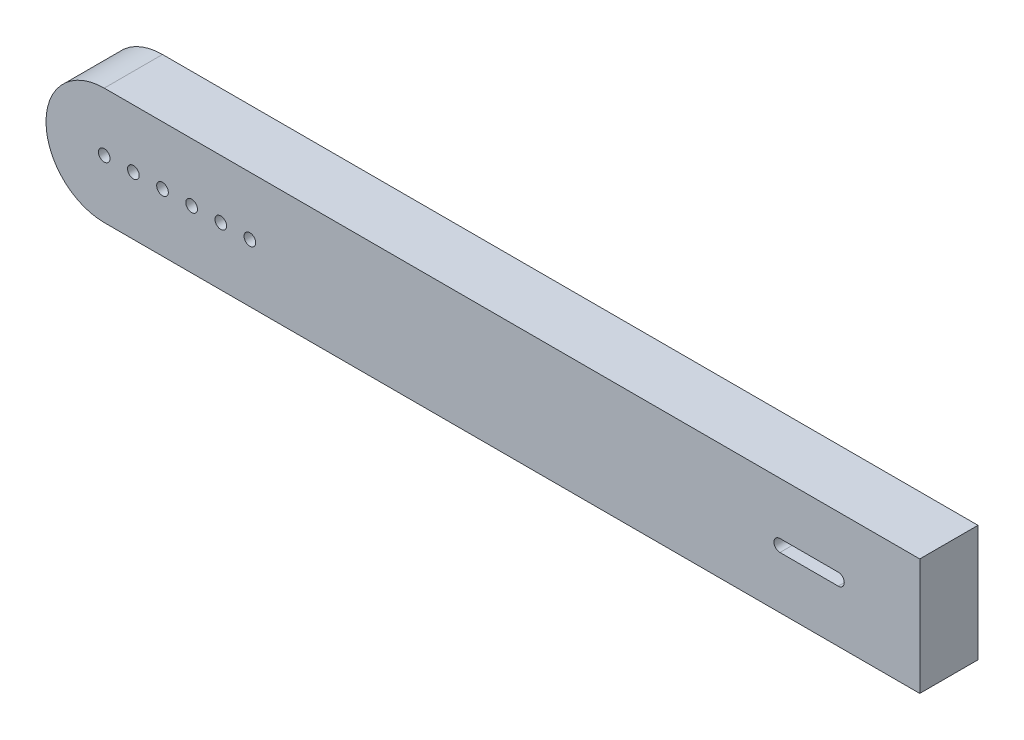
ISO-10303-21;
HEADER;
FILE_DESCRIPTION(('STEP AP214'),'2;1');
FILE_NAME('part.step','',(''),(''),'','','');
FILE_SCHEMA(('AUTOMOTIVE_DESIGN { 1 0 10303 214 1 1 1 1 }'));
ENDSEC;
DATA;
#1=APPLICATION_CONTEXT('core data for automotive mechanical design processes');
#2=APPLICATION_PROTOCOL_DEFINITION('international standard','automotive_design',2000,#1);
#3=PRODUCT_CONTEXT('',#1,'mechanical');
#4=PRODUCT('Part','Part','',(#3));
#5=PRODUCT_RELATED_PRODUCT_CATEGORY('part','',(#4));
#6=PRODUCT_DEFINITION_FORMATION('','',#4);
#7=PRODUCT_DEFINITION_CONTEXT('part definition',#1,'design');
#8=PRODUCT_DEFINITION('design','',#6,#7);
#9=PRODUCT_DEFINITION_SHAPE('','',#8);
#10=(LENGTH_UNIT() NAMED_UNIT(*) SI_UNIT(.MILLI.,.METRE.));
#11=(NAMED_UNIT(*) PLANE_ANGLE_UNIT() SI_UNIT($,.RADIAN.));
#12=(NAMED_UNIT(*) SI_UNIT($,.STERADIAN.) SOLID_ANGLE_UNIT());
#13=UNCERTAINTY_MEASURE_WITH_UNIT(LENGTH_MEASURE(1.E-05),#10,'distance_accuracy_value','');
#14=(GEOMETRIC_REPRESENTATION_CONTEXT(3) GLOBAL_UNCERTAINTY_ASSIGNED_CONTEXT((#13)) GLOBAL_UNIT_ASSIGNED_CONTEXT((#10,
#11,#12)) REPRESENTATION_CONTEXT('',''));
#15=CARTESIAN_POINT('',(0.,0.,0.));
#16=DIRECTION('',(0.,0.,1.));
#17=DIRECTION('',(1.,0.,0.));
#18=AXIS2_PLACEMENT_3D('',#15,#16,#17);
#19=CARTESIAN_POINT('',(-37.7797527357395,-0.499321037751495,6.35));
#20=DIRECTION('',(0.,0.,-1.));
#21=DIRECTION('',(-1.,0.,0.));
#22=AXIS2_PLACEMENT_3D('',#19,#20,#21);
#23=CYLINDRICAL_SURFACE('',#22,0.635000000000003);
#24=CARTESIAN_POINT('',(-37.7797527357395,-0.499321037751495,0.));
#25=DIRECTION('',(0.,0.,1.));
#26=DIRECTION('',(1.,0.,0.));
#27=AXIS2_PLACEMENT_3D('',#24,#25,#26);
#28=CIRCLE('',#27,0.635000000000003);
#29=CARTESIAN_POINT('',(-37.1447527492601,-0.499189998819663,0.));
#30=VERTEX_POINT('',#29);
#31=CARTESIAN_POINT('',(-37.1447527357395,-0.499321037751482,0.));
#32=VERTEX_POINT('',#31);
#33=EDGE_CURVE('E200',#30,#32,#28,.T.);
#34=ORIENTED_EDGE('',*,*,#33,.F.);
#35=DIRECTION('',(0.,0.,-1.));
#36=VECTOR('',#35,1.);
#37=CARTESIAN_POINT('',(-37.1447527492601,-0.499189998819663,6.35));
#38=LINE('',#37,#36);
#39=CARTESIAN_POINT('',(-37.1447527492601,-0.499189998819663,6.35));
#40=VERTEX_POINT('',#39);
#41=EDGE_CURVE('E216',#40,#30,#38,.T.);
#42=ORIENTED_EDGE('',*,*,#41,.F.);
#43=CARTESIAN_POINT('',(-37.7797527357395,-0.499321037751495,6.35));
#44=DIRECTION('',(0.,0.,1.));
#45=DIRECTION('',(1.,0.,0.));
#46=AXIS2_PLACEMENT_3D('',#43,#44,#45);
#47=CIRCLE('',#46,0.635000000000003);
#48=CARTESIAN_POINT('',(-37.1447527357395,-0.499321037751482,6.35));
#49=VERTEX_POINT('',#48);
#50=EDGE_CURVE('E167',#40,#49,#47,.T.);
#51=ORIENTED_EDGE('',*,*,#50,.T.);
#52=DIRECTION('',(0.,0.,-1.));
#53=VECTOR('',#52,1.);
#54=CARTESIAN_POINT('',(-37.1447527357395,-0.499321037751482,6.35));
#55=LINE('',#54,#53);
#56=EDGE_CURVE('E214',#49,#32,#55,.T.);
#57=ORIENTED_EDGE('',*,*,#56,.T.);
#58=EDGE_LOOP('',(#34,#42,#51,#57));
#59=FACE_BOUND('',#58,.T.);
#60=ADVANCED_FACE('F43',(#59),#23,.F.);
#61=CARTESIAN_POINT('',(0.,5.8506789622485,6.35));
#62=DIRECTION('',(0.,1.,0.));
#63=DIRECTION('',(0.,0.,1.));
#64=AXIS2_PLACEMENT_3D('',#61,#62,#63);
#65=PLANE('',#64);
#66=DIRECTION('',(1.,0.,0.));
#67=VECTOR('',#66,1.);
#68=CARTESIAN_POINT('',(0.,5.8506789622485,0.));
#69=LINE('',#68,#67);
#70=CARTESIAN_POINT('',(-40.9547527357395,5.8506789622485,0.));
#71=VERTEX_POINT('',#70);
#72=CARTESIAN_POINT('',(47.9452472642605,5.8506789622485,0.));
#73=VERTEX_POINT('',#72);
#74=EDGE_CURVE('E185',#71,#73,#69,.T.);
#75=ORIENTED_EDGE('',*,*,#74,.F.);
#76=DIRECTION('',(0.,0.,-1.));
#77=VECTOR('',#76,1.);
#78=CARTESIAN_POINT('',(-40.9547527357395,5.8506789622485,6.35));
#79=LINE('',#78,#77);
#80=CARTESIAN_POINT('',(-40.9547527357395,5.8506789622485,6.35));
#81=VERTEX_POINT('',#80);
#82=EDGE_CURVE('E217',#81,#71,#79,.T.);
#83=ORIENTED_EDGE('',*,*,#82,.F.);
#84=DIRECTION('',(1.,0.,0.));
#85=VECTOR('',#84,1.);
#86=CARTESIAN_POINT('',(0.,5.8506789622485,6.35));
#87=LINE('',#86,#85);
#88=CARTESIAN_POINT('',(47.9452472642605,5.8506789622485,6.35));
#89=VERTEX_POINT('',#88);
#90=EDGE_CURVE('E152',#81,#89,#87,.T.);
#91=ORIENTED_EDGE('',*,*,#90,.T.);
#92=DIRECTION('',(0.,0.,-1.));
#93=VECTOR('',#92,1.);
#94=CARTESIAN_POINT('',(47.9452472642605,5.8506789622485,6.35));
#95=LINE('',#94,#93);
#96=EDGE_CURVE('E182',#89,#73,#95,.T.);
#97=ORIENTED_EDGE('',*,*,#96,.T.);
#98=EDGE_LOOP('',(#75,#83,#91,#97));
#99=FACE_BOUND('',#98,.T.);
#100=ADVANCED_FACE('F248',(#99),#65,.T.);
#101=CARTESIAN_POINT('',(-40.9547527357395,-0.499321037751496,6.35));
#102=DIRECTION('',(0.,0.,-1.));
#103=DIRECTION('',(-1.,0.,0.));
#104=AXIS2_PLACEMENT_3D('',#101,#102,#103);
#105=CYLINDRICAL_SURFACE('',#104,6.35);
#106=CARTESIAN_POINT('',(-40.9547527357395,-0.499321037751496,0.));
#107=DIRECTION('',(0.,0.,1.));
#108=DIRECTION('',(1.,0.,0.));
#109=AXIS2_PLACEMENT_3D('',#106,#107,#108);
#110=CIRCLE('',#109,6.35);
#111=CARTESIAN_POINT('',(-40.9547527357395,-6.8493210377515,0.));
#112=VERTEX_POINT('',#111);
#113=EDGE_CURVE('E188',#71,#112,#110,.T.);
#114=ORIENTED_EDGE('',*,*,#113,.T.);
#115=DIRECTION('',(0.,0.,-1.));
#116=VECTOR('',#115,1.);
#117=CARTESIAN_POINT('',(-40.9547527357395,-6.8493210377515,6.35));
#118=LINE('',#117,#116);
#119=CARTESIAN_POINT('',(-40.9547527357395,-6.8493210377515,6.35));
#120=VERTEX_POINT('',#119);
#121=EDGE_CURVE('E224',#120,#112,#118,.T.);
#122=ORIENTED_EDGE('',*,*,#121,.F.);
#123=CARTESIAN_POINT('',(-40.9547527357395,-0.499321037751496,6.35));
#124=DIRECTION('',(0.,0.,1.));
#125=DIRECTION('',(1.,0.,0.));
#126=AXIS2_PLACEMENT_3D('',#123,#124,#125);
#127=CIRCLE('',#126,6.35);
#128=EDGE_CURVE('E156',#81,#120,#127,.T.);
#129=ORIENTED_EDGE('',*,*,#128,.F.);
#130=ORIENTED_EDGE('',*,*,#82,.T.);
#131=EDGE_LOOP('',(#114,#122,#129,#130));
#132=FACE_BOUND('',#131,.T.);
#133=ADVANCED_FACE('F254',(#132),#105,.T.);
#134=CARTESIAN_POINT('',(0.,-6.8493210377515,6.35));
#135=DIRECTION('',(0.,1.,0.));
#136=DIRECTION('',(0.,0.,1.));
#137=AXIS2_PLACEMENT_3D('',#134,#135,#136);
#138=PLANE('',#137);
#139=DIRECTION('',(1.,0.,0.));
#140=VECTOR('',#139,1.);
#141=CARTESIAN_POINT('',(0.,-6.8493210377515,0.));
#142=LINE('',#141,#140);
#143=CARTESIAN_POINT('',(47.9452472642605,-6.8493210377515,0.));
#144=VERTEX_POINT('',#143);
#145=EDGE_CURVE('E191',#112,#144,#142,.T.);
#146=ORIENTED_EDGE('',*,*,#145,.T.);
#147=DIRECTION('',(0.,0.,-1.));
#148=VECTOR('',#147,1.);
#149=CARTESIAN_POINT('',(47.9452472642605,-6.8493210377515,6.35));
#150=LINE('',#149,#148);
#151=CARTESIAN_POINT('',(47.9452472642605,-6.8493210377515,6.35));
#152=VERTEX_POINT('',#151);
#153=EDGE_CURVE('E221',#152,#144,#150,.T.);
#154=ORIENTED_EDGE('',*,*,#153,.F.);
#155=DIRECTION('',(1.,0.,0.));
#156=VECTOR('',#155,1.);
#157=CARTESIAN_POINT('',(0.,-6.8493210377515,6.35));
#158=LINE('',#157,#156);
#159=EDGE_CURVE('E159',#120,#152,#158,.T.);
#160=ORIENTED_EDGE('',*,*,#159,.F.);
#161=ORIENTED_EDGE('',*,*,#121,.T.);
#162=EDGE_LOOP('',(#146,#154,#160,#161));
#163=FACE_BOUND('',#162,.T.);
#164=ADVANCED_FACE('F269',(#163),#138,.F.);
#165=CARTESIAN_POINT('',(-25.0797527357395,-0.499321037751407,6.35));
#166=DIRECTION('',(0.,0.,-1.));
#167=DIRECTION('',(-1.,0.,0.));
#168=AXIS2_PLACEMENT_3D('',#165,#166,#167);
#169=CYLINDRICAL_SURFACE('',#168,0.635000000000003);
#170=CARTESIAN_POINT('',(-25.0797527357395,-0.499321037751407,6.35));
#171=DIRECTION('',(0.,0.,1.));
#172=DIRECTION('',(1.,0.,0.));
#173=AXIS2_PLACEMENT_3D('',#170,#171,#172);
#174=CIRCLE('',#173,0.635000000000003);
#175=CARTESIAN_POINT('',(-24.4447527357395,-0.499321037751407,6.35));
#176=VERTEX_POINT('',#175);
#177=EDGE_CURVE('E179',#176,#176,#174,.T.);
#178=ORIENTED_EDGE('',*,*,#177,.T.);
#179=EDGE_LOOP('',(#178));
#180=FACE_BOUND('',#179,.T.);
#181=CARTESIAN_POINT('',(-25.0797527357395,-0.499321037751407,0.));
#182=DIRECTION('',(0.,0.,1.));
#183=DIRECTION('',(1.,0.,0.));
#184=AXIS2_PLACEMENT_3D('',#181,#182,#183);
#185=CIRCLE('',#184,0.635000000000003);
#186=CARTESIAN_POINT('',(-24.4447527357395,-0.499321037751407,0.));
#187=VERTEX_POINT('',#186);
#188=EDGE_CURVE('E153',#187,#187,#185,.T.);
#189=ORIENTED_EDGE('',*,*,#188,.F.);
#190=EDGE_LOOP('',(#189));
#191=FACE_BOUND('',#190,.T.);
#192=ADVANCED_FACE('F272',(#180,#191),#169,.F.);
#193=CARTESIAN_POINT('',(-28.2547527357395,-0.499321037751407,6.35));
#194=DIRECTION('',(0.,0.,-1.));
#195=DIRECTION('',(-1.,0.,0.));
#196=AXIS2_PLACEMENT_3D('',#193,#194,#195);
#197=CYLINDRICAL_SURFACE('',#196,0.635000000000003);
#198=CARTESIAN_POINT('',(-28.2547527357395,-0.499321037751407,6.35));
#199=DIRECTION('',(0.,0.,1.));
#200=DIRECTION('',(1.,0.,0.));
#201=AXIS2_PLACEMENT_3D('',#198,#199,#200);
#202=CIRCLE('',#201,0.635000000000003);
#203=CARTESIAN_POINT('',(-27.6197527357395,-0.499321037751407,6.35));
#204=VERTEX_POINT('',#203);
#205=EDGE_CURVE('E176',#204,#204,#202,.T.);
#206=ORIENTED_EDGE('',*,*,#205,.T.);
#207=EDGE_LOOP('',(#206));
#208=FACE_BOUND('',#207,.T.);
#209=CARTESIAN_POINT('',(-28.2547527357395,-0.499321037751407,0.));
#210=DIRECTION('',(0.,0.,1.));
#211=DIRECTION('',(1.,0.,0.));
#212=AXIS2_PLACEMENT_3D('',#209,#210,#211);
#213=CIRCLE('',#212,0.635000000000003);
#214=CARTESIAN_POINT('',(-27.6197527357395,-0.499321037751407,0.));
#215=VERTEX_POINT('',#214);
#216=EDGE_CURVE('E209',#215,#215,#213,.T.);
#217=ORIENTED_EDGE('',*,*,#216,.F.);
#218=EDGE_LOOP('',(#217));
#219=FACE_BOUND('',#218,.T.);
#220=ADVANCED_FACE('F303',(#208,#219),#197,.F.);
#221=CARTESIAN_POINT('',(-34.6047527357395,-0.499321037751407,6.35));
#222=DIRECTION('',(0.,0.,-1.));
#223=DIRECTION('',(-1.,0.,0.));
#224=AXIS2_PLACEMENT_3D('',#221,#222,#223);
#225=CYLINDRICAL_SURFACE('',#224,0.635000000000003);
#226=CARTESIAN_POINT('',(-34.6047527357395,-0.499321037751407,6.35));
#227=DIRECTION('',(0.,0.,1.));
#228=DIRECTION('',(1.,0.,0.));
#229=AXIS2_PLACEMENT_3D('',#226,#227,#228);
#230=CIRCLE('',#229,0.635000000000003);
#231=CARTESIAN_POINT('',(-33.9697527357395,-0.499321037751407,6.35));
#232=VERTEX_POINT('',#231);
#233=EDGE_CURVE('E173',#232,#232,#230,.T.);
#234=ORIENTED_EDGE('',*,*,#233,.T.);
#235=EDGE_LOOP('',(#234));
#236=FACE_BOUND('',#235,.T.);
#237=CARTESIAN_POINT('',(-34.6047527357395,-0.499321037751407,0.));
#238=DIRECTION('',(0.,0.,1.));
#239=DIRECTION('',(1.,0.,0.));
#240=AXIS2_PLACEMENT_3D('',#237,#238,#239);
#241=CIRCLE('',#240,0.635000000000003);
#242=CARTESIAN_POINT('',(-33.9697527357395,-0.499321037751407,0.));
#243=VERTEX_POINT('',#242);
#244=EDGE_CURVE('E206',#243,#243,#241,.T.);
#245=ORIENTED_EDGE('',*,*,#244,.F.);
#246=EDGE_LOOP('',(#245));
#247=FACE_BOUND('',#246,.T.);
#248=ADVANCED_FACE('F310',(#236,#247),#225,.F.);
#249=CARTESIAN_POINT('',(-37.1448038603568,-0.00383260995463427,6.35));
#250=DIRECTION('',(-0.999999994676918,-0.000103180244231236,0.));
#251=DIRECTION('',(0.000103180244231236,-0.999999994676919,0.));
#252=AXIS2_PLACEMENT_3D('',#249,#250,#251);
#253=PLANE('',#252);
#254=DIRECTION('',(-0.000103180244231236,0.999999994676919,0.));
#255=VECTOR('',#254,1.);
#256=CARTESIAN_POINT('',(-37.1448038603568,-0.00383260995463427,0.));
#257=LINE('',#256,#255);
#258=EDGE_CURVE('E203',#32,#30,#257,.T.);
#259=ORIENTED_EDGE('',*,*,#258,.F.);
#260=ORIENTED_EDGE('',*,*,#56,.F.);
#261=DIRECTION('',(-0.000103180244231236,0.999999994676919,0.));
#262=VECTOR('',#261,1.);
#263=CARTESIAN_POINT('',(-37.1448038603568,-0.00383260995463427,6.35));
#264=LINE('',#263,#262);
#265=EDGE_CURVE('E170',#49,#40,#264,.T.);
#266=ORIENTED_EDGE('',*,*,#265,.T.);
#267=ORIENTED_EDGE('',*,*,#41,.T.);
#268=EDGE_LOOP('',(#259,#260,#266,#267));
#269=FACE_BOUND('',#268,.T.);
#270=ADVANCED_FACE('F259',(#269),#253,.T.);
#271=CARTESIAN_POINT('',(-40.9547527357395,-0.499321037751496,6.35));
#272=DIRECTION('',(0.,0.,-1.));
#273=DIRECTION('',(-1.,0.,0.));
#274=AXIS2_PLACEMENT_3D('',#271,#272,#273);
#275=CYLINDRICAL_SURFACE('',#274,0.635000000000003);
#276=CARTESIAN_POINT('',(-40.9547527357395,-0.499321037751496,6.35));
#277=DIRECTION('',(0.,0.,1.));
#278=DIRECTION('',(1.,0.,0.));
#279=AXIS2_PLACEMENT_3D('',#276,#277,#278);
#280=CIRCLE('',#279,0.635000000000003);
#281=CARTESIAN_POINT('',(-40.3197527357395,-0.499321037751496,6.35));
#282=VERTEX_POINT('',#281);
#283=EDGE_CURVE('E164',#282,#282,#280,.T.);
#284=ORIENTED_EDGE('',*,*,#283,.T.);
#285=EDGE_LOOP('',(#284));
#286=FACE_BOUND('',#285,.T.);
#287=CARTESIAN_POINT('',(-40.9547527357395,-0.499321037751496,0.));
#288=DIRECTION('',(0.,0.,1.));
#289=DIRECTION('',(1.,0.,0.));
#290=AXIS2_PLACEMENT_3D('',#287,#288,#289);
#291=CIRCLE('',#290,0.635000000000003);
#292=CARTESIAN_POINT('',(-40.3197527357395,-0.499321037751496,0.));
#293=VERTEX_POINT('',#292);
#294=EDGE_CURVE('E197',#293,#293,#291,.T.);
#295=ORIENTED_EDGE('',*,*,#294,.F.);
#296=EDGE_LOOP('',(#295));
#297=FACE_BOUND('',#296,.T.);
#298=ADVANCED_FACE('F261',(#286,#297),#275,.F.);
#299=CARTESIAN_POINT('',(47.9452472642605,0.,6.35));
#300=DIRECTION('',(-1.,0.,0.));
#301=DIRECTION('',(0.,0.,1.));
#302=AXIS2_PLACEMENT_3D('',#299,#300,#301);
#303=PLANE('',#302);
#304=DIRECTION('',(0.,1.,0.));
#305=VECTOR('',#304,1.);
#306=CARTESIAN_POINT('',(47.9452472642605,0.,0.));
#307=LINE('',#306,#305);
#308=EDGE_CURVE('E194',#144,#73,#307,.T.);
#309=ORIENTED_EDGE('',*,*,#308,.T.);
#310=ORIENTED_EDGE('',*,*,#96,.F.);
#311=DIRECTION('',(0.,1.,0.));
#312=VECTOR('',#311,1.);
#313=CARTESIAN_POINT('',(47.9452472642605,0.,6.35));
#314=LINE('',#313,#312);
#315=EDGE_CURVE('E162',#152,#89,#314,.T.);
#316=ORIENTED_EDGE('',*,*,#315,.F.);
#317=ORIENTED_EDGE('',*,*,#153,.T.);
#318=EDGE_LOOP('',(#309,#310,#316,#317));
#319=FACE_BOUND('',#318,.T.);
#320=ADVANCED_FACE('F264',(#319),#303,.F.);
#321=CARTESIAN_POINT('',(-31.4297527357395,-0.499321037751407,6.35));
#322=DIRECTION('',(0.,0.,-1.));
#323=DIRECTION('',(-1.,0.,0.));
#324=AXIS2_PLACEMENT_3D('',#321,#322,#323);
#325=CYLINDRICAL_SURFACE('',#324,0.635000000000003);
#326=CARTESIAN_POINT('',(-31.4297527357395,-0.499321037751407,6.35));
#327=DIRECTION('',(0.,0.,1.));
#328=DIRECTION('',(1.,0.,0.));
#329=AXIS2_PLACEMENT_3D('',#326,#327,#328);
#330=CIRCLE('',#329,0.635000000000003);
#331=CARTESIAN_POINT('',(-30.7947527357395,-0.499321037751407,6.35));
#332=VERTEX_POINT('',#331);
#333=EDGE_CURVE('E149',#332,#332,#330,.T.);
#334=ORIENTED_EDGE('',*,*,#333,.T.);
#335=EDGE_LOOP('',(#334));
#336=FACE_BOUND('',#335,.T.);
#337=CARTESIAN_POINT('',(-31.4297527357395,-0.499321037751407,0.));
#338=DIRECTION('',(0.,0.,1.));
#339=DIRECTION('',(1.,0.,0.));
#340=AXIS2_PLACEMENT_3D('',#337,#338,#339);
#341=CIRCLE('',#340,0.635000000000003);
#342=CARTESIAN_POINT('',(-30.7947527357395,-0.499321037751407,0.));
#343=VERTEX_POINT('',#342);
#344=EDGE_CURVE('E146',#343,#343,#341,.T.);
#345=ORIENTED_EDGE('',*,*,#344,.F.);
#346=EDGE_LOOP('',(#345));
#347=FACE_BOUND('',#346,.T.);
#348=ADVANCED_FACE('F45',(#336,#347),#325,.F.);
#349=CARTESIAN_POINT('',(0.,0.,6.35));
#350=DIRECTION('',(0.,0.,1.));
#351=DIRECTION('',(1.,0.,0.));
#352=AXIS2_PLACEMENT_3D('',#349,#350,#351);
#353=PLANE('',#352);
#354=CARTESIAN_POINT('',(32.7052472642605,-0.499321037751486,6.35));
#355=DIRECTION('',(0.,0.,1.));
#356=DIRECTION('',(1.,0.,0.));
#357=AXIS2_PLACEMENT_3D('',#354,#355,#356);
#358=CIRCLE('',#357,0.6604);
#359=CARTESIAN_POINT('',(32.7052472642605,0.161078962248514,6.35));
#360=VERTEX_POINT('',#359);
#361=CARTESIAN_POINT('',(32.7052472642605,-1.15972103775149,6.35));
#362=VERTEX_POINT('',#361);
#363=EDGE_CURVE('E58',#360,#362,#358,.T.);
#364=ORIENTED_EDGE('',*,*,#363,.F.);
#365=DIRECTION('',(1.,0.,0.));
#366=VECTOR('',#365,1.);
#367=CARTESIAN_POINT('',(32.7052472642605,0.161078962248514,6.35));
#368=LINE('',#367,#366);
#369=CARTESIAN_POINT('',(39.0552472642605,0.161078962248514,6.35));
#370=VERTEX_POINT('',#369);
#371=EDGE_CURVE('E139',#360,#370,#368,.T.);
#372=ORIENTED_EDGE('',*,*,#371,.T.);
#373=CARTESIAN_POINT('',(39.0552472642605,-0.499321037751486,6.35));
#374=DIRECTION('',(0.,0.,1.));
#375=DIRECTION('',(1.,0.,0.));
#376=AXIS2_PLACEMENT_3D('',#373,#374,#375);
#377=CIRCLE('',#376,0.6604);
#378=CARTESIAN_POINT('',(39.0552472642605,-1.15972103775149,6.35));
#379=VERTEX_POINT('',#378);
#380=EDGE_CURVE('E123',#379,#370,#377,.T.);
#381=ORIENTED_EDGE('',*,*,#380,.F.);
#382=DIRECTION('',(1.,0.,0.));
#383=VECTOR('',#382,1.);
#384=CARTESIAN_POINT('',(32.7052472642605,-1.15972103775149,6.35));
#385=LINE('',#384,#383);
#386=EDGE_CURVE('E132',#362,#379,#385,.T.);
#387=ORIENTED_EDGE('',*,*,#386,.F.);
#388=EDGE_LOOP('',(#364,#372,#381,#387));
#389=FACE_BOUND('',#388,.T.);
#390=ORIENTED_EDGE('',*,*,#333,.F.);
#391=EDGE_LOOP('',(#390));
#392=FACE_BOUND('',#391,.T.);
#393=ORIENTED_EDGE('',*,*,#90,.F.);
#394=ORIENTED_EDGE('',*,*,#128,.T.);
#395=ORIENTED_EDGE('',*,*,#159,.T.);
#396=ORIENTED_EDGE('',*,*,#315,.T.);
#397=EDGE_LOOP('',(#393,#394,#395,#396));
#398=FACE_BOUND('',#397,.T.);
#399=ORIENTED_EDGE('',*,*,#283,.F.);
#400=EDGE_LOOP('',(#399));
#401=FACE_BOUND('',#400,.T.);
#402=ORIENTED_EDGE('',*,*,#50,.F.);
#403=ORIENTED_EDGE('',*,*,#265,.F.);
#404=EDGE_LOOP('',(#402,#403));
#405=FACE_BOUND('',#404,.T.);
#406=ORIENTED_EDGE('',*,*,#233,.F.);
#407=EDGE_LOOP('',(#406));
#408=FACE_BOUND('',#407,.T.);
#409=ORIENTED_EDGE('',*,*,#205,.F.);
#410=EDGE_LOOP('',(#409));
#411=FACE_BOUND('',#410,.T.);
#412=ORIENTED_EDGE('',*,*,#177,.F.);
#413=EDGE_LOOP('',(#412));
#414=FACE_BOUND('',#413,.T.);
#415=ADVANCED_FACE('F136',(#389,#392,#398,#401,#405,#408,#411,#414),#353,.T.);
#416=CARTESIAN_POINT('',(0.,0.,0.));
#417=DIRECTION('',(0.,0.,1.));
#418=DIRECTION('',(1.,0.,0.));
#419=AXIS2_PLACEMENT_3D('',#416,#417,#418);
#420=PLANE('',#419);
#421=DIRECTION('',(1.,0.,0.));
#422=VECTOR('',#421,1.);
#423=CARTESIAN_POINT('',(0.,0.161078962248514,0.));
#424=LINE('',#423,#422);
#425=CARTESIAN_POINT('',(32.7052472642605,0.161078962248514,0.));
#426=VERTEX_POINT('',#425);
#427=CARTESIAN_POINT('',(39.0552472642605,0.161078962248514,0.));
#428=VERTEX_POINT('',#427);
#429=EDGE_CURVE('E51',#426,#428,#424,.T.);
#430=ORIENTED_EDGE('',*,*,#429,.F.);
#431=CARTESIAN_POINT('',(32.7052472642605,-0.499321037751486,0.));
#432=DIRECTION('',(0.,0.,1.));
#433=DIRECTION('',(1.,0.,0.));
#434=AXIS2_PLACEMENT_3D('',#431,#432,#433);
#435=CIRCLE('',#434,0.6604);
#436=CARTESIAN_POINT('',(32.7052472642605,-1.15972103775149,0.));
#437=VERTEX_POINT('',#436);
#438=EDGE_CURVE('E11',#426,#437,#435,.T.);
#439=ORIENTED_EDGE('',*,*,#438,.T.);
#440=DIRECTION('',(1.,0.,0.));
#441=VECTOR('',#440,1.);
#442=CARTESIAN_POINT('',(0.,-1.15972103775149,0.));
#443=LINE('',#442,#441);
#444=CARTESIAN_POINT('',(39.0552472642605,-1.15972103775149,0.));
#445=VERTEX_POINT('',#444);
#446=EDGE_CURVE('E219',#437,#445,#443,.T.);
#447=ORIENTED_EDGE('',*,*,#446,.T.);
#448=CARTESIAN_POINT('',(39.0552472642605,-0.499321037751486,0.));
#449=DIRECTION('',(0.,0.,1.));
#450=DIRECTION('',(1.,0.,0.));
#451=AXIS2_PLACEMENT_3D('',#448,#449,#450);
#452=CIRCLE('',#451,0.6604);
#453=EDGE_CURVE('E126',#445,#428,#452,.T.);
#454=ORIENTED_EDGE('',*,*,#453,.T.);
#455=EDGE_LOOP('',(#430,#439,#447,#454));
#456=FACE_BOUND('',#455,.T.);
#457=ORIENTED_EDGE('',*,*,#344,.T.);
#458=EDGE_LOOP('',(#457));
#459=FACE_BOUND('',#458,.T.);
#460=ORIENTED_EDGE('',*,*,#74,.T.);
#461=ORIENTED_EDGE('',*,*,#308,.F.);
#462=ORIENTED_EDGE('',*,*,#145,.F.);
#463=ORIENTED_EDGE('',*,*,#113,.F.);
#464=EDGE_LOOP('',(#460,#461,#462,#463));
#465=FACE_BOUND('',#464,.T.);
#466=ORIENTED_EDGE('',*,*,#294,.T.);
#467=EDGE_LOOP('',(#466));
#468=FACE_BOUND('',#467,.T.);
#469=ORIENTED_EDGE('',*,*,#33,.T.);
#470=ORIENTED_EDGE('',*,*,#258,.T.);
#471=EDGE_LOOP('',(#469,#470));
#472=FACE_BOUND('',#471,.T.);
#473=ORIENTED_EDGE('',*,*,#244,.T.);
#474=EDGE_LOOP('',(#473));
#475=FACE_BOUND('',#474,.T.);
#476=ORIENTED_EDGE('',*,*,#216,.T.);
#477=EDGE_LOOP('',(#476));
#478=FACE_BOUND('',#477,.T.);
#479=ORIENTED_EDGE('',*,*,#188,.T.);
#480=EDGE_LOOP('',(#479));
#481=FACE_BOUND('',#480,.T.);
#482=ADVANCED_FACE('F234',(#456,#459,#465,#468,#472,#475,#478,#481),#420,.F.);
#483=CARTESIAN_POINT('',(32.7052472642605,-0.499321037751486,-19.05));
#484=DIRECTION('',(0.,0.,1.));
#485=DIRECTION('',(1.,0.,0.));
#486=AXIS2_PLACEMENT_3D('',#483,#484,#485);
#487=CYLINDRICAL_SURFACE('',#486,0.6604);
#488=DIRECTION('',(0.,0.,1.));
#489=VECTOR('',#488,1.);
#490=CARTESIAN_POINT('',(32.7052472642605,0.161078962248514,-19.05));
#491=LINE('',#490,#489);
#492=EDGE_CURVE('E144',#426,#360,#491,.T.);
#493=ORIENTED_EDGE('',*,*,#492,.T.);
#494=ORIENTED_EDGE('',*,*,#363,.T.);
#495=DIRECTION('',(0.,0.,1.));
#496=VECTOR('',#495,1.);
#497=CARTESIAN_POINT('',(32.7052472642605,-1.15972103775149,-19.05));
#498=LINE('',#497,#496);
#499=EDGE_CURVE('E129',#437,#362,#498,.T.);
#500=ORIENTED_EDGE('',*,*,#499,.F.);
#501=ORIENTED_EDGE('',*,*,#438,.F.);
#502=EDGE_LOOP('',(#493,#494,#500,#501));
#503=FACE_BOUND('',#502,.T.);
#504=ADVANCED_FACE('F236',(#503),#487,.F.);
#505=CARTESIAN_POINT('',(32.7052472642605,0.161078962248514,-19.05));
#506=DIRECTION('',(0.,-1.,0.));
#507=DIRECTION('',(0.,0.,-1.));
#508=AXIS2_PLACEMENT_3D('',#505,#506,#507);
#509=PLANE('',#508);
#510=ORIENTED_EDGE('',*,*,#429,.T.);
#511=DIRECTION('',(0.,0.,1.));
#512=VECTOR('',#511,1.);
#513=CARTESIAN_POINT('',(39.0552472642605,0.161078962248514,-19.05));
#514=LINE('',#513,#512);
#515=EDGE_CURVE('E128',#428,#370,#514,.T.);
#516=ORIENTED_EDGE('',*,*,#515,.T.);
#517=ORIENTED_EDGE('',*,*,#371,.F.);
#518=ORIENTED_EDGE('',*,*,#492,.F.);
#519=EDGE_LOOP('',(#510,#516,#517,#518));
#520=FACE_BOUND('',#519,.T.);
#521=ADVANCED_FACE('F232',(#520),#509,.T.);
#522=CARTESIAN_POINT('',(39.0552472642605,-0.499321037751486,-19.05));
#523=DIRECTION('',(0.,0.,1.));
#524=DIRECTION('',(1.,0.,0.));
#525=AXIS2_PLACEMENT_3D('',#522,#523,#524);
#526=CYLINDRICAL_SURFACE('',#525,0.6604);
#527=DIRECTION('',(0.,0.,1.));
#528=VECTOR('',#527,1.);
#529=CARTESIAN_POINT('',(39.0552472642605,-1.15972103775149,-19.05));
#530=LINE('',#529,#528);
#531=EDGE_CURVE('E66',#445,#379,#530,.T.);
#532=ORIENTED_EDGE('',*,*,#531,.T.);
#533=ORIENTED_EDGE('',*,*,#380,.T.);
#534=ORIENTED_EDGE('',*,*,#515,.F.);
#535=ORIENTED_EDGE('',*,*,#453,.F.);
#536=EDGE_LOOP('',(#532,#533,#534,#535));
#537=FACE_BOUND('',#536,.T.);
#538=ADVANCED_FACE('F120',(#537),#526,.F.);
#539=CARTESIAN_POINT('',(32.7052472642605,-1.15972103775149,-19.05));
#540=DIRECTION('',(0.,-1.,0.));
#541=DIRECTION('',(0.,0.,-1.));
#542=AXIS2_PLACEMENT_3D('',#539,#540,#541);
#543=PLANE('',#542);
#544=ORIENTED_EDGE('',*,*,#499,.T.);
#545=ORIENTED_EDGE('',*,*,#386,.T.);
#546=ORIENTED_EDGE('',*,*,#531,.F.);
#547=ORIENTED_EDGE('',*,*,#446,.F.);
#548=EDGE_LOOP('',(#544,#545,#546,#547));
#549=FACE_BOUND('',#548,.T.);
#550=ADVANCED_FACE('F133',(#549),#543,.F.);
#551=CLOSED_SHELL('',(#60,#100,#133,#164,#192,#220,#248,#270,#298,#320,#348,#415,#482,#504,#521,
#538,#550));
#552=MANIFOLD_SOLID_BREP('B2',#551);
#553=ADVANCED_BREP_SHAPE_REPRESENTATION('',(#18,#552),#14);
#554=SHAPE_DEFINITION_REPRESENTATION(#9,#553);
ENDSEC;
END-ISO-10303-21;
